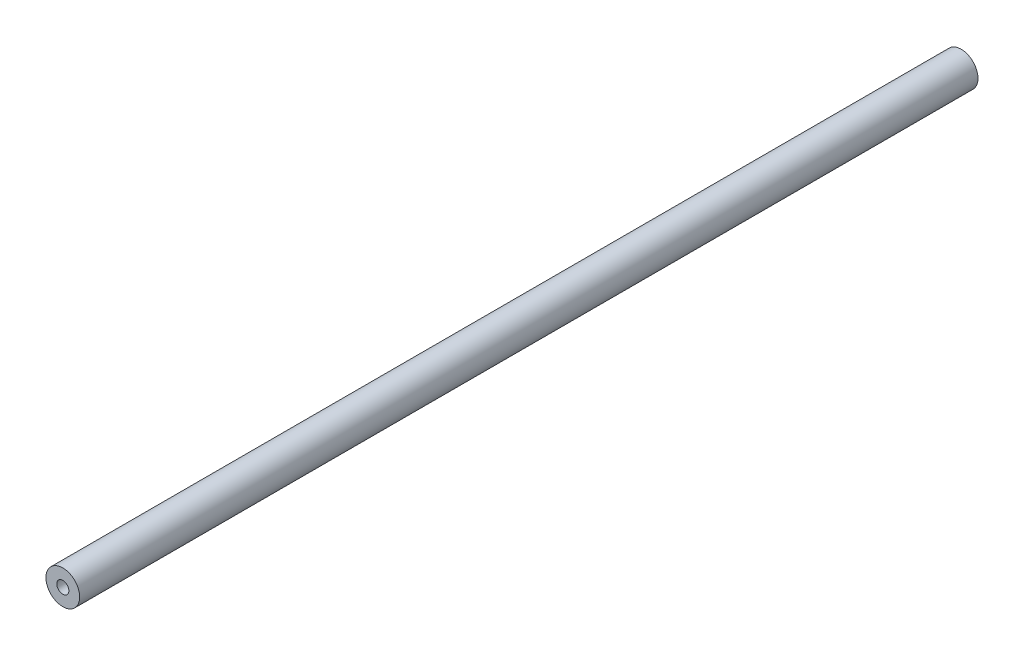
ISO-10303-21;
HEADER;
FILE_DESCRIPTION(('STEP AP214'),'2;1');
FILE_NAME('part.step','',(''),(''),'','','');
FILE_SCHEMA(('AUTOMOTIVE_DESIGN { 1 0 10303 214 1 1 1 1 }'));
ENDSEC;
DATA;
#1=APPLICATION_CONTEXT('core data for automotive mechanical design processes');
#2=APPLICATION_PROTOCOL_DEFINITION('international standard','automotive_design',2000,#1);
#3=PRODUCT_CONTEXT('',#1,'mechanical');
#4=PRODUCT('Part','Part','',(#3));
#5=PRODUCT_RELATED_PRODUCT_CATEGORY('part','',(#4));
#6=PRODUCT_DEFINITION_FORMATION('','',#4);
#7=PRODUCT_DEFINITION_CONTEXT('part definition',#1,'design');
#8=PRODUCT_DEFINITION('design','',#6,#7);
#9=PRODUCT_DEFINITION_SHAPE('','',#8);
#10=(LENGTH_UNIT() NAMED_UNIT(*) SI_UNIT(.MILLI.,.METRE.));
#11=(NAMED_UNIT(*) PLANE_ANGLE_UNIT() SI_UNIT($,.RADIAN.));
#12=(NAMED_UNIT(*) SI_UNIT($,.STERADIAN.) SOLID_ANGLE_UNIT());
#13=UNCERTAINTY_MEASURE_WITH_UNIT(LENGTH_MEASURE(1.E-05),#10,'distance_accuracy_value','');
#14=(GEOMETRIC_REPRESENTATION_CONTEXT(3) GLOBAL_UNCERTAINTY_ASSIGNED_CONTEXT((#13)) GLOBAL_UNIT_ASSIGNED_CONTEXT((#10,
#11,#12)) REPRESENTATION_CONTEXT('',''));
#15=CARTESIAN_POINT('',(0.,0.,0.));
#16=DIRECTION('',(0.,0.,1.));
#17=DIRECTION('',(1.,0.,0.));
#18=AXIS2_PLACEMENT_3D('',#15,#16,#17);
#19=CARTESIAN_POINT('',(0.,0.,320.));
#20=DIRECTION('',(0.,0.,-1.));
#21=DIRECTION('',(-1.,0.,0.));
#22=AXIS2_PLACEMENT_3D('',#19,#20,#21);
#23=CYLINDRICAL_SURFACE('',#22,6.);
#24=CARTESIAN_POINT('',(0.,0.,320.));
#25=DIRECTION('',(0.,0.,1.));
#26=DIRECTION('',(1.,0.,0.));
#27=AXIS2_PLACEMENT_3D('',#24,#25,#26);
#28=CIRCLE('',#27,6.);
#29=CARTESIAN_POINT('',(6.,0.,320.));
#30=VERTEX_POINT('',#29);
#31=EDGE_CURVE('E10',#30,#30,#28,.T.);
#32=ORIENTED_EDGE('',*,*,#31,.F.);
#33=EDGE_LOOP('',(#32));
#34=FACE_BOUND('',#33,.T.);
#35=CARTESIAN_POINT('',(0.,0.,0.));
#36=DIRECTION('',(0.,0.,1.));
#37=DIRECTION('',(1.,0.,0.));
#38=AXIS2_PLACEMENT_3D('',#35,#36,#37);
#39=CIRCLE('',#38,6.);
#40=CARTESIAN_POINT('',(6.,0.,0.));
#41=VERTEX_POINT('',#40);
#42=EDGE_CURVE('E38',#41,#41,#39,.T.);
#43=ORIENTED_EDGE('',*,*,#42,.T.);
#44=EDGE_LOOP('',(#43));
#45=FACE_BOUND('',#44,.T.);
#46=ADVANCED_FACE('F35',(#34,#45),#23,.T.);
#47=CARTESIAN_POINT('',(0.,0.,320.));
#48=DIRECTION('',(0.,0.,1.));
#49=DIRECTION('',(1.,0.,0.));
#50=AXIS2_PLACEMENT_3D('',#47,#48,#49);
#51=PLANE('',#50);
#52=CARTESIAN_POINT('',(0.,0.,320.));
#53=DIRECTION('',(0.,0.,1.));
#54=DIRECTION('',(1.,0.,0.));
#55=AXIS2_PLACEMENT_3D('',#52,#53,#54);
#56=CIRCLE('',#55,2.15);
#57=CARTESIAN_POINT('',(2.15,0.,320.));
#58=VERTEX_POINT('',#57);
#59=EDGE_CURVE('E47',#58,#58,#56,.T.);
#60=ORIENTED_EDGE('',*,*,#59,.F.);
#61=EDGE_LOOP('',(#60));
#62=FACE_BOUND('',#61,.T.);
#63=ORIENTED_EDGE('',*,*,#31,.T.);
#64=EDGE_LOOP('',(#63));
#65=FACE_BOUND('',#64,.T.);
#66=ADVANCED_FACE('F72',(#62,#65),#51,.T.);
#67=CARTESIAN_POINT('',(0.,0.,0.));
#68=DIRECTION('',(0.,0.,1.));
#69=DIRECTION('',(1.,0.,0.));
#70=AXIS2_PLACEMENT_3D('',#67,#68,#69);
#71=PLANE('',#70);
#72=CARTESIAN_POINT('',(0.,0.,0.));
#73=DIRECTION('',(0.,0.,-1.));
#74=DIRECTION('',(-1.,0.,0.));
#75=AXIS2_PLACEMENT_3D('',#72,#73,#74);
#76=CIRCLE('',#75,2.15);
#77=CARTESIAN_POINT('',(-2.15,0.,0.));
#78=VERTEX_POINT('',#77);
#79=EDGE_CURVE('E53',#78,#78,#76,.T.);
#80=ORIENTED_EDGE('',*,*,#79,.F.);
#81=EDGE_LOOP('',(#80));
#82=FACE_BOUND('',#81,.T.);
#83=ORIENTED_EDGE('',*,*,#42,.F.);
#84=EDGE_LOOP('',(#83));
#85=FACE_BOUND('',#84,.T.);
#86=ADVANCED_FACE('F68',(#82,#85),#71,.F.);
#87=CARTESIAN_POINT('',(0.,0.,300.));
#88=DIRECTION('',(0.,0.,1.));
#89=DIRECTION('',(1.,0.,0.));
#90=AXIS2_PLACEMENT_3D('',#87,#88,#89);
#91=CYLINDRICAL_SURFACE('',#90,2.15);
#92=CARTESIAN_POINT('',(0.,0.,300.));
#93=DIRECTION('',(0.,0.,1.));
#94=DIRECTION('',(1.,0.,0.));
#95=AXIS2_PLACEMENT_3D('',#92,#93,#94);
#96=CIRCLE('',#95,2.15);
#97=CARTESIAN_POINT('',(2.15,0.,300.));
#98=VERTEX_POINT('',#97);
#99=EDGE_CURVE('E45',#98,#98,#96,.T.);
#100=ORIENTED_EDGE('',*,*,#99,.F.);
#101=EDGE_LOOP('',(#100));
#102=FACE_BOUND('',#101,.T.);
#103=ORIENTED_EDGE('',*,*,#59,.T.);
#104=EDGE_LOOP('',(#103));
#105=FACE_BOUND('',#104,.T.);
#106=ADVANCED_FACE('F71',(#102,#105),#91,.F.);
#107=CARTESIAN_POINT('',(0.,0.,300.));
#108=DIRECTION('',(0.,0.,1.));
#109=DIRECTION('',(1.,0.,0.));
#110=AXIS2_PLACEMENT_3D('',#107,#108,#109);
#111=PLANE('',#110);
#112=ORIENTED_EDGE('',*,*,#99,.T.);
#113=EDGE_LOOP('',(#112));
#114=FACE_BOUND('',#113,.T.);
#115=ADVANCED_FACE('F64',(#114),#111,.T.);
#116=CARTESIAN_POINT('',(0.,0.,20.));
#117=DIRECTION('',(0.,0.,-1.));
#118=DIRECTION('',(-1.,0.,0.));
#119=AXIS2_PLACEMENT_3D('',#116,#117,#118);
#120=CYLINDRICAL_SURFACE('',#119,2.15);
#121=CARTESIAN_POINT('',(0.,0.,20.));
#122=DIRECTION('',(0.,0.,-1.));
#123=DIRECTION('',(-1.,0.,0.));
#124=AXIS2_PLACEMENT_3D('',#121,#122,#123);
#125=CIRCLE('',#124,2.15);
#126=CARTESIAN_POINT('',(-2.15,0.,20.));
#127=VERTEX_POINT('',#126);
#128=EDGE_CURVE('E50',#127,#127,#125,.T.);
#129=ORIENTED_EDGE('',*,*,#128,.F.);
#130=EDGE_LOOP('',(#129));
#131=FACE_BOUND('',#130,.T.);
#132=ORIENTED_EDGE('',*,*,#79,.T.);
#133=EDGE_LOOP('',(#132));
#134=FACE_BOUND('',#133,.T.);
#135=ADVANCED_FACE('F61',(#131,#134),#120,.F.);
#136=CARTESIAN_POINT('',(0.,0.,20.));
#137=DIRECTION('',(0.,0.,-1.));
#138=DIRECTION('',(-1.,0.,0.));
#139=AXIS2_PLACEMENT_3D('',#136,#137,#138);
#140=PLANE('',#139);
#141=ORIENTED_EDGE('',*,*,#128,.T.);
#142=EDGE_LOOP('',(#141));
#143=FACE_BOUND('',#142,.T.);
#144=ADVANCED_FACE('F59',(#143),#140,.T.);
#145=CLOSED_SHELL('',(#46,#66,#86,#106,#115,#135,#144));
#146=MANIFOLD_SOLID_BREP('B2',#145);
#147=ADVANCED_BREP_SHAPE_REPRESENTATION('',(#18,#146),#14);
#148=SHAPE_DEFINITION_REPRESENTATION(#9,#147);
ENDSEC;
END-ISO-10303-21;
